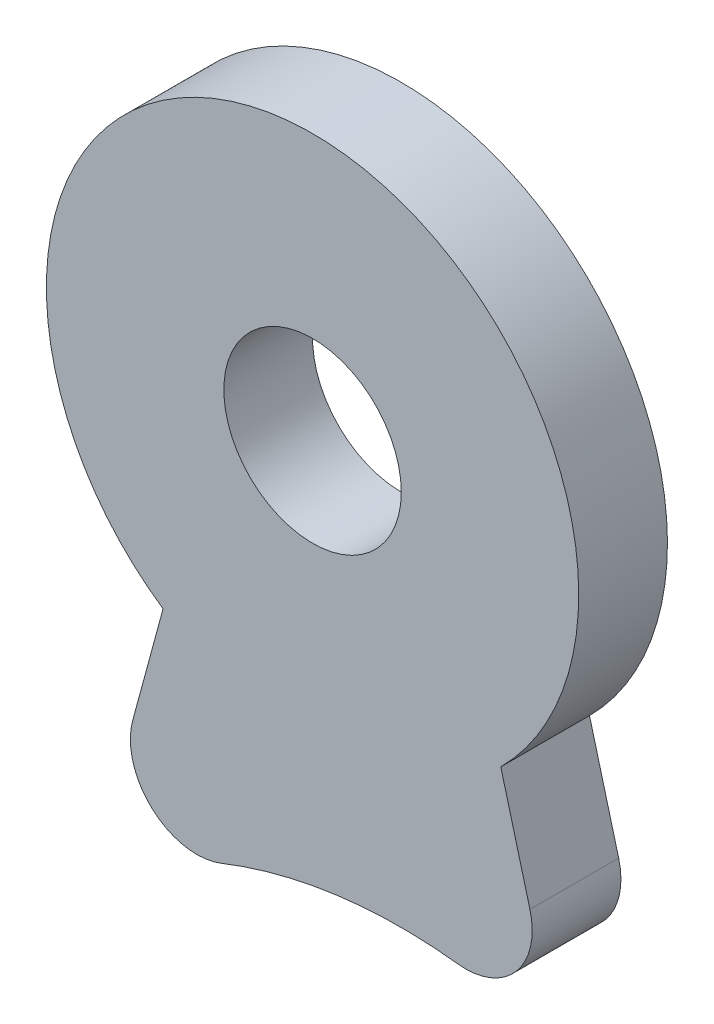
ISO-10303-21;
HEADER;
FILE_DESCRIPTION(('STEP AP214'),'2;1');
FILE_NAME('part.step','',(''),(''),'','','');
FILE_SCHEMA(('AUTOMOTIVE_DESIGN { 1 0 10303 214 1 1 1 1 }'));
ENDSEC;
DATA;
#1=APPLICATION_CONTEXT('core data for automotive mechanical design processes');
#2=APPLICATION_PROTOCOL_DEFINITION('international standard','automotive_design',2000,#1);
#3=PRODUCT_CONTEXT('',#1,'mechanical');
#4=PRODUCT('Part','Part','',(#3));
#5=PRODUCT_RELATED_PRODUCT_CATEGORY('part','',(#4));
#6=PRODUCT_DEFINITION_FORMATION('','',#4);
#7=PRODUCT_DEFINITION_CONTEXT('part definition',#1,'design');
#8=PRODUCT_DEFINITION('design','',#6,#7);
#9=PRODUCT_DEFINITION_SHAPE('','',#8);
#10=(LENGTH_UNIT() NAMED_UNIT(*) SI_UNIT(.MILLI.,.METRE.));
#11=(NAMED_UNIT(*) PLANE_ANGLE_UNIT() SI_UNIT($,.RADIAN.));
#12=(NAMED_UNIT(*) SI_UNIT($,.STERADIAN.) SOLID_ANGLE_UNIT());
#13=UNCERTAINTY_MEASURE_WITH_UNIT(LENGTH_MEASURE(1.E-05),#10,'distance_accuracy_value','');
#14=(GEOMETRIC_REPRESENTATION_CONTEXT(3) GLOBAL_UNCERTAINTY_ASSIGNED_CONTEXT((#13)) GLOBAL_UNIT_ASSIGNED_CONTEXT((#10,
#11,#12)) REPRESENTATION_CONTEXT('',''));
#15=CARTESIAN_POINT('',(0.,0.,0.));
#16=DIRECTION('',(0.,0.,1.));
#17=DIRECTION('',(1.,0.,0.));
#18=AXIS2_PLACEMENT_3D('',#15,#16,#17);
#19=CARTESIAN_POINT('',(-174.416251328011,-25.1721603850015,2.));
#20=DIRECTION('',(0.,0.,-1.));
#21=DIRECTION('',(-1.,0.,0.));
#22=AXIS2_PLACEMENT_3D('',#19,#20,#21);
#23=CYLINDRICAL_SURFACE('',#22,6.00000000000002);
#24=CARTESIAN_POINT('',(-174.416251328011,-25.1721603850015,0.));
#25=DIRECTION('',(0.,0.,1.));
#26=DIRECTION('',(1.,0.,0.));
#27=AXIS2_PLACEMENT_3D('',#24,#25,#26);
#28=CIRCLE('',#27,6.00000000000002);
#29=CARTESIAN_POINT('',(-170.173610641153,-29.4148010723819,0.));
#30=VERTEX_POINT('',#29);
#31=CARTESIAN_POINT('',(-177.78627055048,-30.1363290404956,0.));
#32=VERTEX_POINT('',#31);
#33=EDGE_CURVE('E105',#30,#32,#28,.T.);
#34=ORIENTED_EDGE('',*,*,#33,.T.);
#35=DIRECTION('',(0.,0.,-1.));
#36=VECTOR('',#35,1.);
#37=CARTESIAN_POINT('',(-177.78627055048,-30.1363290404956,2.));
#38=LINE('',#37,#36);
#39=CARTESIAN_POINT('',(-177.78627055048,-30.1363290404956,2.));
#40=VERTEX_POINT('',#39);
#41=EDGE_CURVE('E92',#40,#32,#38,.T.);
#42=ORIENTED_EDGE('',*,*,#41,.F.);
#43=CARTESIAN_POINT('',(-174.416251328011,-25.1721603850015,2.));
#44=DIRECTION('',(0.,0.,1.));
#45=DIRECTION('',(1.,0.,0.));
#46=AXIS2_PLACEMENT_3D('',#43,#44,#45);
#47=CIRCLE('',#46,6.00000000000002);
#48=CARTESIAN_POINT('',(-170.173610641153,-29.4148010723819,2.));
#49=VERTEX_POINT('',#48);
#50=EDGE_CURVE('E96',#49,#40,#47,.T.);
#51=ORIENTED_EDGE('',*,*,#50,.F.);
#52=DIRECTION('',(0.,0.,-1.));
#53=VECTOR('',#52,1.);
#54=CARTESIAN_POINT('',(-170.173610641153,-29.4148010723819,2.));
#55=LINE('',#54,#53);
#56=EDGE_CURVE('E107',#49,#30,#55,.T.);
#57=ORIENTED_EDGE('',*,*,#56,.T.);
#58=EDGE_LOOP('',(#34,#42,#51,#57));
#59=FACE_BOUND('',#58,.T.);
#60=ADVANCED_FACE('F34',(#59),#23,.T.);
#61=CARTESIAN_POINT('',(-157.968634140736,42.8767622426203,2.));
#62=DIRECTION('',(0.96508195176001,-0.261948136826911,0.));
#63=DIRECTION('',(0.261948136826911,0.96508195176001,0.));
#64=AXIS2_PLACEMENT_3D('',#61,#62,#63);
#65=PLANE('',#64);
#66=DIRECTION('',(-0.261948136826911,-0.96508195176001,0.));
#67=VECTOR('',#66,1.);
#68=CARTESIAN_POINT('',(-157.968634140736,42.8767622426203,0.));
#69=LINE('',#68,#67);
#70=CARTESIAN_POINT('',(-178.471059683422,-32.6592621713409,0.));
#71=VERTEX_POINT('',#70);
#72=EDGE_CURVE('E133',#32,#71,#69,.T.);
#73=ORIENTED_EDGE('',*,*,#72,.T.);
#74=DIRECTION('',(0.,0.,-1.));
#75=VECTOR('',#74,1.);
#76=CARTESIAN_POINT('',(-178.471059683422,-32.6592621713409,2.));
#77=LINE('',#76,#75);
#78=CARTESIAN_POINT('',(-178.471059683422,-32.6592621713409,2.));
#79=VERTEX_POINT('',#78);
#80=EDGE_CURVE('E57',#71,#79,#77,.F.);
#81=ORIENTED_EDGE('',*,*,#80,.T.);
#82=DIRECTION('',(-0.261948136826911,-0.96508195176001,0.));
#83=VECTOR('',#82,1.);
#84=CARTESIAN_POINT('',(-157.968634140736,42.8767622426203,2.));
#85=LINE('',#84,#83);
#86=EDGE_CURVE('E88',#40,#79,#85,.T.);
#87=ORIENTED_EDGE('',*,*,#86,.F.);
#88=ORIENTED_EDGE('',*,*,#41,.T.);
#89=EDGE_LOOP('',(#73,#81,#87,#88));
#90=FACE_BOUND('',#89,.T.);
#91=ADVANCED_FACE('F90',(#90),#65,.F.);
#92=CARTESIAN_POINT('',(-172.416251329011,-44.6721603850015,2.));
#93=DIRECTION('',(0.,0.,-1.));
#94=DIRECTION('',(-1.,0.,0.));
#95=AXIS2_PLACEMENT_3D('',#92,#93,#94);
#96=CYLINDRICAL_SURFACE('',#95,10.9999999997165);
#97=CARTESIAN_POINT('',(-172.416251329011,-44.6721603850015,2.));
#98=DIRECTION('',(0.,0.,1.));
#99=DIRECTION('',(1.,0.,0.));
#100=AXIS2_PLACEMENT_3D('',#97,#98,#99);
#101=CIRCLE('',#100,10.9999999997165);
#102=CARTESIAN_POINT('',(-176.470574504557,-34.4465814976233,2.));
#103=VERTEX_POINT('',#102);
#104=CARTESIAN_POINT('',(-171.139188939347,-33.746543164603,2.));
#105=VERTEX_POINT('',#104);
#106=EDGE_CURVE('E95',#103,#105,#101,.F.);
#107=ORIENTED_EDGE('',*,*,#106,.F.);
#108=DIRECTION('',(0.,0.,-1.));
#109=VECTOR('',#108,1.);
#110=CARTESIAN_POINT('',(-176.470574504557,-34.4465814976233,2.));
#111=LINE('',#110,#109);
#112=CARTESIAN_POINT('',(-176.470574504557,-34.4465814976233,0.));
#113=VERTEX_POINT('',#112);
#114=EDGE_CURVE('E109',#103,#113,#111,.T.);
#115=ORIENTED_EDGE('',*,*,#114,.T.);
#116=CARTESIAN_POINT('',(-172.416251329011,-44.6721603850015,0.));
#117=DIRECTION('',(0.,0.,1.));
#118=DIRECTION('',(1.,0.,0.));
#119=AXIS2_PLACEMENT_3D('',#116,#117,#118);
#120=CIRCLE('',#119,10.9999999997165);
#121=CARTESIAN_POINT('',(-171.139188939347,-33.746543164603,0.));
#122=VERTEX_POINT('',#121);
#123=EDGE_CURVE('E134',#113,#122,#120,.F.);
#124=ORIENTED_EDGE('',*,*,#123,.T.);
#125=DIRECTION('',(0.,0.,-1.));
#126=VECTOR('',#125,1.);
#127=CARTESIAN_POINT('',(-171.139188939347,-33.746543164603,2.));
#128=LINE('',#127,#126);
#129=EDGE_CURVE('E106',#122,#105,#128,.F.);
#130=ORIENTED_EDGE('',*,*,#129,.T.);
#131=EDGE_LOOP('',(#107,#115,#124,#130));
#132=FACE_BOUND('',#131,.T.);
#133=ADVANCED_FACE('F125',(#132),#96,.F.);
#134=CARTESIAN_POINT('',(-174.416251328011,-25.1721603850015,2.));
#135=DIRECTION('',(0.,0.,-1.));
#136=DIRECTION('',(-1.,0.,0.));
#137=AXIS2_PLACEMENT_3D('',#134,#135,#136);
#138=CYLINDRICAL_SURFACE('',#137,2.);
#139=CARTESIAN_POINT('',(-174.416251328011,-25.1721603850015,2.));
#140=DIRECTION('',(0.,0.,1.));
#141=DIRECTION('',(1.,0.,0.));
#142=AXIS2_PLACEMENT_3D('',#139,#140,#141);
#143=CIRCLE('',#142,2.);
#144=CARTESIAN_POINT('',(-172.416251328011,-25.1721603850015,2.));
#145=VERTEX_POINT('',#144);
#146=EDGE_CURVE('E102',#145,#145,#143,.T.);
#147=ORIENTED_EDGE('',*,*,#146,.T.);
#148=EDGE_LOOP('',(#147));
#149=FACE_BOUND('',#148,.T.);
#150=CARTESIAN_POINT('',(-174.416251328011,-25.1721603850015,0.));
#151=DIRECTION('',(0.,0.,1.));
#152=DIRECTION('',(1.,0.,0.));
#153=AXIS2_PLACEMENT_3D('',#150,#151,#152);
#154=CIRCLE('',#153,2.);
#155=CARTESIAN_POINT('',(-172.416251328011,-25.1721603850015,0.));
#156=VERTEX_POINT('',#155);
#157=EDGE_CURVE('E138',#156,#156,#154,.T.);
#158=ORIENTED_EDGE('',*,*,#157,.F.);
#159=EDGE_LOOP('',(#158));
#160=FACE_BOUND('',#159,.T.);
#161=ADVANCED_FACE('F152',(#149,#160),#138,.F.);
#162=CARTESIAN_POINT('',(-166.127840527117,-44.5138206977246,2.));
#163=DIRECTION('',(0.965925826306283,0.258819045038276,0.));
#164=DIRECTION('',(-0.258819045038276,0.965925826306283,0.));
#165=AXIS2_PLACEMENT_3D('',#162,#163,#164);
#166=PLANE('',#165);
#167=DIRECTION('',(0.258819045038276,-0.965925826306283,0.));
#168=VECTOR('',#167,1.);
#169=CARTESIAN_POINT('',(-166.127840527117,-44.5138206977246,2.));
#170=LINE('',#169,#168);
#171=CARTESIAN_POINT('',(-169.516155328565,-31.8684577033164,2.));
#172=VERTEX_POINT('',#171);
#173=EDGE_CURVE('E100',#49,#172,#170,.T.);
#174=ORIENTED_EDGE('',*,*,#173,.T.);
#175=DIRECTION('',(0.,0.,1.));
#176=VECTOR('',#175,1.);
#177=CARTESIAN_POINT('',(-169.516155328565,-31.8684577033164,0.));
#178=LINE('',#177,#176);
#179=CARTESIAN_POINT('',(-169.516155328565,-31.8684577033164,0.));
#180=VERTEX_POINT('',#179);
#181=EDGE_CURVE('E11',#172,#180,#178,.F.);
#182=ORIENTED_EDGE('',*,*,#181,.T.);
#183=DIRECTION('',(0.258819045038276,-0.965925826306283,0.));
#184=VECTOR('',#183,1.);
#185=CARTESIAN_POINT('',(-166.127840527117,-44.5138206977246,0.));
#186=LINE('',#185,#184);
#187=EDGE_CURVE('E136',#30,#180,#186,.T.);
#188=ORIENTED_EDGE('',*,*,#187,.F.);
#189=ORIENTED_EDGE('',*,*,#56,.F.);
#190=EDGE_LOOP('',(#174,#182,#188,#189));
#191=FACE_BOUND('',#190,.T.);
#192=ADVANCED_FACE('F154',(#191),#166,.T.);
#193=CARTESIAN_POINT('',(0.,0.,2.));
#194=DIRECTION('',(0.,0.,1.));
#195=DIRECTION('',(1.,0.,0.));
#196=AXIS2_PLACEMENT_3D('',#193,#194,#195);
#197=PLANE('',#196);
#198=ORIENTED_EDGE('',*,*,#146,.F.);
#199=EDGE_LOOP('',(#198));
#200=FACE_BOUND('',#199,.T.);
#201=ORIENTED_EDGE('',*,*,#86,.T.);
#202=CARTESIAN_POINT('',(-177.023436755782,-33.0521843765813,2.));
#203=DIRECTION('',(0.,0.,1.));
#204=DIRECTION('',(1.,0.,0.));
#205=AXIS2_PLACEMENT_3D('',#202,#203,#204);
#206=CIRCLE('',#205,1.5);
#207=EDGE_CURVE('E42',#79,#103,#206,.T.);
#208=ORIENTED_EDGE('',*,*,#207,.T.);
#209=ORIENTED_EDGE('',*,*,#106,.T.);
#210=CARTESIAN_POINT('',(-170.965044068025,-32.2566862708739,2.));
#211=DIRECTION('',(0.,0.,1.));
#212=DIRECTION('',(1.,0.,0.));
#213=AXIS2_PLACEMENT_3D('',#210,#211,#212);
#214=CIRCLE('',#213,1.5);
#215=EDGE_CURVE('E49',#105,#172,#214,.T.);
#216=ORIENTED_EDGE('',*,*,#215,.T.);
#217=ORIENTED_EDGE('',*,*,#173,.F.);
#218=ORIENTED_EDGE('',*,*,#50,.T.);
#219=EDGE_LOOP('',(#201,#208,#209,#216,#217,#218));
#220=FACE_BOUND('',#219,.T.);
#221=ADVANCED_FACE('F99',(#200,#220),#197,.T.);
#222=CARTESIAN_POINT('',(0.,0.,0.));
#223=DIRECTION('',(0.,0.,1.));
#224=DIRECTION('',(1.,0.,0.));
#225=AXIS2_PLACEMENT_3D('',#222,#223,#224);
#226=PLANE('',#225);
#227=ORIENTED_EDGE('',*,*,#157,.T.);
#228=EDGE_LOOP('',(#227));
#229=FACE_BOUND('',#228,.T.);
#230=ORIENTED_EDGE('',*,*,#123,.F.);
#231=CARTESIAN_POINT('',(-177.023436755782,-33.0521843765813,0.));
#232=DIRECTION('',(0.,0.,1.));
#233=DIRECTION('',(1.,0.,0.));
#234=AXIS2_PLACEMENT_3D('',#231,#232,#233);
#235=CIRCLE('',#234,1.5);
#236=EDGE_CURVE('E118',#113,#71,#235,.F.);
#237=ORIENTED_EDGE('',*,*,#236,.T.);
#238=ORIENTED_EDGE('',*,*,#72,.F.);
#239=ORIENTED_EDGE('',*,*,#33,.F.);
#240=ORIENTED_EDGE('',*,*,#187,.T.);
#241=CARTESIAN_POINT('',(-170.965044068025,-32.2566862708739,0.));
#242=DIRECTION('',(0.,0.,1.));
#243=DIRECTION('',(1.,0.,0.));
#244=AXIS2_PLACEMENT_3D('',#241,#242,#243);
#245=CIRCLE('',#244,1.5);
#246=EDGE_CURVE('E116',#180,#122,#245,.F.);
#247=ORIENTED_EDGE('',*,*,#246,.T.);
#248=EDGE_LOOP('',(#230,#237,#238,#239,#240,#247));
#249=FACE_BOUND('',#248,.T.);
#250=ADVANCED_FACE('F132',(#229,#249),#226,.F.);
#251=CARTESIAN_POINT('',(-177.023436755782,-33.0521843765813,2.));
#252=DIRECTION('',(0.,0.,-1.));
#253=DIRECTION('',(-1.,0.,0.));
#254=AXIS2_PLACEMENT_3D('',#251,#252,#253);
#255=CYLINDRICAL_SURFACE('',#254,1.5);
#256=ORIENTED_EDGE('',*,*,#207,.F.);
#257=ORIENTED_EDGE('',*,*,#80,.F.);
#258=ORIENTED_EDGE('',*,*,#236,.F.);
#259=ORIENTED_EDGE('',*,*,#114,.F.);
#260=EDGE_LOOP('',(#256,#257,#258,#259));
#261=FACE_BOUND('',#260,.T.);
#262=ADVANCED_FACE('F130',(#261),#255,.T.);
#263=CARTESIAN_POINT('',(-170.965044068025,-32.2566862708739,2.));
#264=DIRECTION('',(0.,0.,-1.));
#265=DIRECTION('',(-1.,0.,0.));
#266=AXIS2_PLACEMENT_3D('',#263,#264,#265);
#267=CYLINDRICAL_SURFACE('',#266,1.5);
#268=ORIENTED_EDGE('',*,*,#215,.F.);
#269=ORIENTED_EDGE('',*,*,#129,.F.);
#270=ORIENTED_EDGE('',*,*,#246,.F.);
#271=ORIENTED_EDGE('',*,*,#181,.F.);
#272=EDGE_LOOP('',(#268,#269,#270,#271));
#273=FACE_BOUND('',#272,.T.);
#274=ADVANCED_FACE('F36',(#273),#267,.T.);
#275=CLOSED_SHELL('',(#60,#91,#133,#161,#192,#221,#250,#262,#274));
#276=MANIFOLD_SOLID_BREP('B2',#275);
#277=ADVANCED_BREP_SHAPE_REPRESENTATION('',(#18,#276),#14);
#278=SHAPE_DEFINITION_REPRESENTATION(#9,#277);
ENDSEC;
END-ISO-10303-21;
